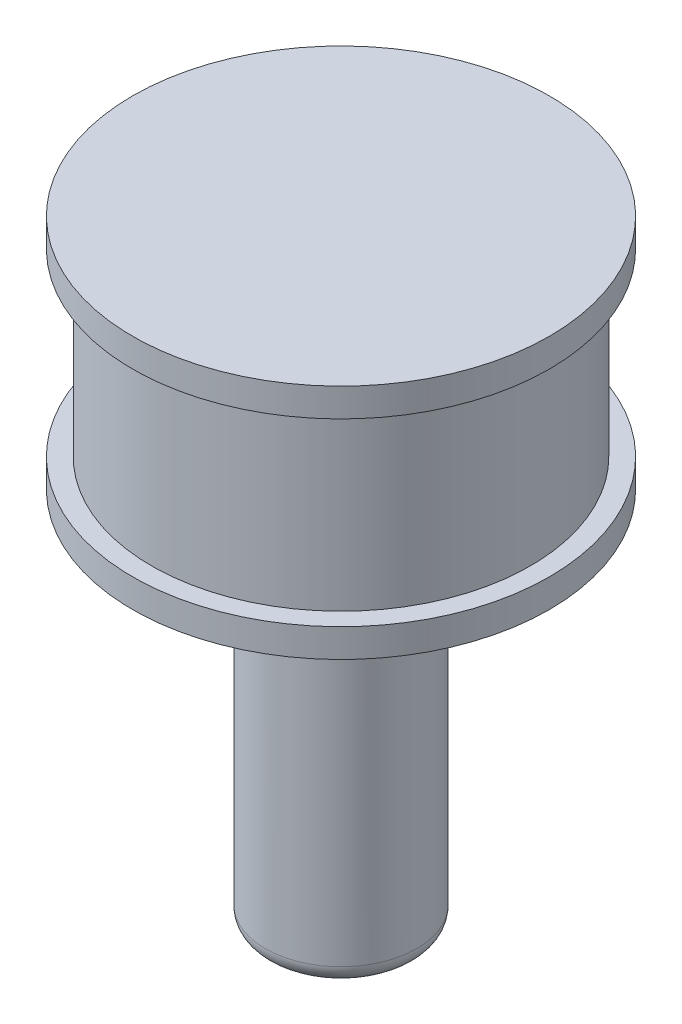
ISO-10303-21;
HEADER;
FILE_DESCRIPTION(('STEP AP214'),'2;1');
FILE_NAME('part.step','',(''),(''),'','','');
FILE_SCHEMA(('AUTOMOTIVE_DESIGN { 1 0 10303 214 1 1 1 1 }'));
ENDSEC;
DATA;
#1=APPLICATION_CONTEXT('core data for automotive mechanical design processes');
#2=APPLICATION_PROTOCOL_DEFINITION('international standard','automotive_design',2000,#1);
#3=PRODUCT_CONTEXT('',#1,'mechanical');
#4=PRODUCT('Part','Part','',(#3));
#5=PRODUCT_RELATED_PRODUCT_CATEGORY('part','',(#4));
#6=PRODUCT_DEFINITION_FORMATION('','',#4);
#7=PRODUCT_DEFINITION_CONTEXT('part definition',#1,'design');
#8=PRODUCT_DEFINITION('design','',#6,#7);
#9=PRODUCT_DEFINITION_SHAPE('','',#8);
#10=(LENGTH_UNIT() NAMED_UNIT(*) SI_UNIT(.MILLI.,.METRE.));
#11=(NAMED_UNIT(*) PLANE_ANGLE_UNIT() SI_UNIT($,.RADIAN.));
#12=(NAMED_UNIT(*) SI_UNIT($,.STERADIAN.) SOLID_ANGLE_UNIT());
#13=UNCERTAINTY_MEASURE_WITH_UNIT(LENGTH_MEASURE(1.E-05),#10,'distance_accuracy_value','');
#14=(GEOMETRIC_REPRESENTATION_CONTEXT(3) GLOBAL_UNCERTAINTY_ASSIGNED_CONTEXT((#13)) GLOBAL_UNIT_ASSIGNED_CONTEXT((#10,
#11,#12)) REPRESENTATION_CONTEXT('',''));
#15=CARTESIAN_POINT('',(0.,0.,0.));
#16=DIRECTION('',(0.,0.,1.));
#17=DIRECTION('',(1.,0.,0.));
#18=AXIS2_PLACEMENT_3D('',#15,#16,#17);
#19=CARTESIAN_POINT('',(0.,-20.,0.));
#20=DIRECTION('',(0.,-1.,0.));
#21=DIRECTION('',(1.,0.,0.));
#22=AXIS2_PLACEMENT_3D('',#19,#20,#21);
#23=PLANE('',#22);
#24=CARTESIAN_POINT('',(0.,-20.,0.));
#25=DIRECTION('',(0.,-1.,0.));
#26=DIRECTION('',(1.,0.,0.));
#27=AXIS2_PLACEMENT_3D('',#24,#25,#26);
#28=CIRCLE('',#27,3.);
#29=CARTESIAN_POINT('',(3.,-20.,0.));
#30=VERTEX_POINT('',#29);
#31=EDGE_CURVE('E10',#30,#30,#28,.T.);
#32=ORIENTED_EDGE('',*,*,#31,.T.);
#33=EDGE_LOOP('',(#32));
#34=FACE_BOUND('',#33,.T.);
#35=ADVANCED_FACE('F37',(#34),#23,.T.);
#36=CARTESIAN_POINT('',(0.,12.5,0.));
#37=DIRECTION('',(0.,1.,0.));
#38=DIRECTION('',(-1.,0.,0.));
#39=AXIS2_PLACEMENT_3D('',#36,#37,#38);
#40=CYLINDRICAL_SURFACE('',#39,4.);
#41=CARTESIAN_POINT('',(0.,-19.,0.));
#42=DIRECTION('',(0.,-1.,0.));
#43=DIRECTION('',(1.,0.,0.));
#44=AXIS2_PLACEMENT_3D('',#41,#42,#43);
#45=CIRCLE('',#44,4.);
#46=CARTESIAN_POINT('',(4.,-19.,0.));
#47=VERTEX_POINT('',#46);
#48=EDGE_CURVE('E45',#47,#47,#45,.F.);
#49=ORIENTED_EDGE('',*,*,#48,.T.);
#50=EDGE_LOOP('',(#49));
#51=FACE_BOUND('',#50,.T.);
#52=CARTESIAN_POINT('',(0.,0.,0.));
#53=DIRECTION('',(0.,1.,0.));
#54=DIRECTION('',(-1.,0.,0.));
#55=AXIS2_PLACEMENT_3D('',#52,#53,#54);
#56=CIRCLE('',#55,4.);
#57=CARTESIAN_POINT('',(-4.,0.,0.));
#58=VERTEX_POINT('',#57);
#59=EDGE_CURVE('E50',#58,#58,#56,.T.);
#60=ORIENTED_EDGE('',*,*,#59,.F.);
#61=EDGE_LOOP('',(#60));
#62=FACE_BOUND('',#61,.T.);
#63=ADVANCED_FACE('F98',(#51,#62),#40,.T.);
#64=CARTESIAN_POINT('',(-4.,0.,0.));
#65=DIRECTION('',(0.,-1.,0.));
#66=DIRECTION('',(1.,0.,0.));
#67=AXIS2_PLACEMENT_3D('',#64,#65,#66);
#68=PLANE('',#67);
#69=ORIENTED_EDGE('',*,*,#59,.T.);
#70=EDGE_LOOP('',(#69));
#71=FACE_BOUND('',#70,.T.);
#72=CARTESIAN_POINT('',(0.,0.,0.));
#73=DIRECTION('',(0.,1.,0.));
#74=DIRECTION('',(-1.,0.,0.));
#75=AXIS2_PLACEMENT_3D('',#72,#73,#74);
#76=CIRCLE('',#75,11.);
#77=CARTESIAN_POINT('',(-11.,0.,0.));
#78=VERTEX_POINT('',#77);
#79=EDGE_CURVE('E55',#78,#78,#76,.T.);
#80=ORIENTED_EDGE('',*,*,#79,.F.);
#81=EDGE_LOOP('',(#80));
#82=FACE_BOUND('',#81,.T.);
#83=ADVANCED_FACE('F102',(#71,#82),#68,.T.);
#84=CARTESIAN_POINT('',(0.,12.5,0.));
#85=DIRECTION('',(0.,1.,0.));
#86=DIRECTION('',(-1.,0.,0.));
#87=AXIS2_PLACEMENT_3D('',#84,#85,#86);
#88=CYLINDRICAL_SURFACE('',#87,11.);
#89=ORIENTED_EDGE('',*,*,#79,.T.);
#90=EDGE_LOOP('',(#89));
#91=FACE_BOUND('',#90,.T.);
#92=CARTESIAN_POINT('',(0.,1.5,0.));
#93=DIRECTION('',(0.,1.,0.));
#94=DIRECTION('',(-1.,0.,0.));
#95=AXIS2_PLACEMENT_3D('',#92,#93,#94);
#96=CIRCLE('',#95,11.);
#97=CARTESIAN_POINT('',(-11.,1.5,0.));
#98=VERTEX_POINT('',#97);
#99=EDGE_CURVE('E61',#98,#98,#96,.T.);
#100=ORIENTED_EDGE('',*,*,#99,.F.);
#101=EDGE_LOOP('',(#100));
#102=FACE_BOUND('',#101,.T.);
#103=ADVANCED_FACE('F107',(#91,#102),#88,.T.);
#104=CARTESIAN_POINT('',(-11.,1.5,0.));
#105=DIRECTION('',(0.,1.,0.));
#106=DIRECTION('',(-1.,0.,0.));
#107=AXIS2_PLACEMENT_3D('',#104,#105,#106);
#108=PLANE('',#107);
#109=ORIENTED_EDGE('',*,*,#99,.T.);
#110=EDGE_LOOP('',(#109));
#111=FACE_BOUND('',#110,.T.);
#112=CARTESIAN_POINT('',(0.,1.5,0.));
#113=DIRECTION('',(0.,1.,0.));
#114=DIRECTION('',(-1.,0.,0.));
#115=AXIS2_PLACEMENT_3D('',#112,#113,#114);
#116=CIRCLE('',#115,10.);
#117=CARTESIAN_POINT('',(-10.,1.5,0.));
#118=VERTEX_POINT('',#117);
#119=EDGE_CURVE('E65',#118,#118,#116,.T.);
#120=ORIENTED_EDGE('',*,*,#119,.F.);
#121=EDGE_LOOP('',(#120));
#122=FACE_BOUND('',#121,.T.);
#123=ADVANCED_FACE('F111',(#111,#122),#108,.T.);
#124=CARTESIAN_POINT('',(0.,12.5,0.));
#125=DIRECTION('',(0.,1.,0.));
#126=DIRECTION('',(-1.,0.,0.));
#127=AXIS2_PLACEMENT_3D('',#124,#125,#126);
#128=CYLINDRICAL_SURFACE('',#127,10.);
#129=ORIENTED_EDGE('',*,*,#119,.T.);
#130=EDGE_LOOP('',(#129));
#131=FACE_BOUND('',#130,.T.);
#132=CARTESIAN_POINT('',(0.,11.,0.));
#133=DIRECTION('',(0.,1.,0.));
#134=DIRECTION('',(-1.,0.,0.));
#135=AXIS2_PLACEMENT_3D('',#132,#133,#134);
#136=CIRCLE('',#135,10.);
#137=CARTESIAN_POINT('',(-10.,11.,0.));
#138=VERTEX_POINT('',#137);
#139=EDGE_CURVE('E69',#138,#138,#136,.T.);
#140=ORIENTED_EDGE('',*,*,#139,.F.);
#141=EDGE_LOOP('',(#140));
#142=FACE_BOUND('',#141,.T.);
#143=ADVANCED_FACE('F94',(#131,#142),#128,.T.);
#144=CARTESIAN_POINT('',(-10.,11.,0.));
#145=DIRECTION('',(0.,-1.,0.));
#146=DIRECTION('',(1.,0.,0.));
#147=AXIS2_PLACEMENT_3D('',#144,#145,#146);
#148=PLANE('',#147);
#149=ORIENTED_EDGE('',*,*,#139,.T.);
#150=EDGE_LOOP('',(#149));
#151=FACE_BOUND('',#150,.T.);
#152=CARTESIAN_POINT('',(0.,11.,0.));
#153=DIRECTION('',(0.,1.,0.));
#154=DIRECTION('',(-1.,0.,0.));
#155=AXIS2_PLACEMENT_3D('',#152,#153,#154);
#156=CIRCLE('',#155,11.);
#157=CARTESIAN_POINT('',(-11.,11.,0.));
#158=VERTEX_POINT('',#157);
#159=EDGE_CURVE('E73',#158,#158,#156,.T.);
#160=ORIENTED_EDGE('',*,*,#159,.F.);
#161=EDGE_LOOP('',(#160));
#162=FACE_BOUND('',#161,.T.);
#163=ADVANCED_FACE('F86',(#151,#162),#148,.T.);
#164=CARTESIAN_POINT('',(0.,12.5,0.));
#165=DIRECTION('',(0.,1.,0.));
#166=DIRECTION('',(-1.,0.,0.));
#167=AXIS2_PLACEMENT_3D('',#164,#165,#166);
#168=CYLINDRICAL_SURFACE('',#167,11.);
#169=ORIENTED_EDGE('',*,*,#159,.T.);
#170=EDGE_LOOP('',(#169));
#171=FACE_BOUND('',#170,.T.);
#172=CARTESIAN_POINT('',(0.,12.5,0.));
#173=DIRECTION('',(0.,1.,0.));
#174=DIRECTION('',(-1.,0.,0.));
#175=AXIS2_PLACEMENT_3D('',#172,#173,#174);
#176=CIRCLE('',#175,11.);
#177=CARTESIAN_POINT('',(-11.,12.5,0.));
#178=VERTEX_POINT('',#177);
#179=EDGE_CURVE('E77',#178,#178,#176,.T.);
#180=ORIENTED_EDGE('',*,*,#179,.F.);
#181=EDGE_LOOP('',(#180));
#182=FACE_BOUND('',#181,.T.);
#183=ADVANCED_FACE('F84',(#171,#182),#168,.T.);
#184=CARTESIAN_POINT('',(-11.,12.5,0.));
#185=DIRECTION('',(0.,1.,0.));
#186=DIRECTION('',(-1.,0.,0.));
#187=AXIS2_PLACEMENT_3D('',#184,#185,#186);
#188=PLANE('',#187);
#189=ORIENTED_EDGE('',*,*,#179,.T.);
#190=EDGE_LOOP('',(#189));
#191=FACE_BOUND('',#190,.T.);
#192=ADVANCED_FACE('F82',(#191),#188,.T.);
#193=CARTESIAN_POINT('',(0.,-19.,0.));
#194=DIRECTION('',(0.,-1.,0.));
#195=DIRECTION('',(1.,0.,0.));
#196=AXIS2_PLACEMENT_3D('',#193,#194,#195);
#197=TOROIDAL_SURFACE('',#196,3.,1.);
#198=ORIENTED_EDGE('',*,*,#31,.F.);
#199=EDGE_LOOP('',(#198));
#200=FACE_BOUND('',#199,.T.);
#201=ORIENTED_EDGE('',*,*,#48,.F.);
#202=EDGE_LOOP('',(#201));
#203=FACE_BOUND('',#202,.T.);
#204=ADVANCED_FACE('F39',(#200,#203),#197,.T.);
#205=CLOSED_SHELL('',(#35,#63,#83,#103,#123,#143,#163,#183,#192,#204));
#206=MANIFOLD_SOLID_BREP('B2',#205);
#207=ADVANCED_BREP_SHAPE_REPRESENTATION('',(#18,#206),#14);
#208=SHAPE_DEFINITION_REPRESENTATION(#9,#207);
ENDSEC;
END-ISO-10303-21;
